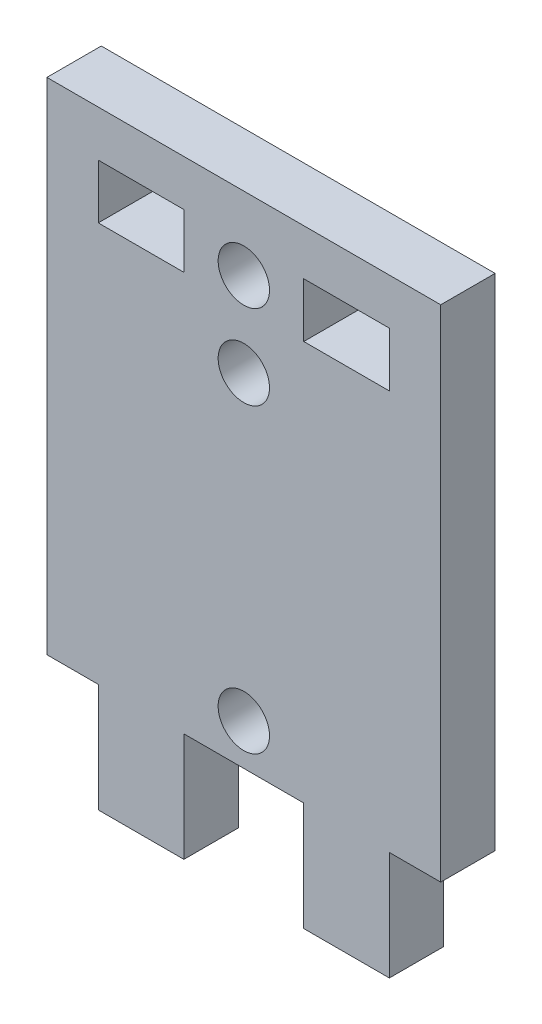
ISO-10303-21;
HEADER;
FILE_DESCRIPTION(('STEP AP214'),'2;1');
FILE_NAME('part.step','',(''),(''),'','','');
FILE_SCHEMA(('AUTOMOTIVE_DESIGN { 1 0 10303 214 1 1 1 1 }'));
ENDSEC;
DATA;
#1=APPLICATION_CONTEXT('core data for automotive mechanical design processes');
#2=APPLICATION_PROTOCOL_DEFINITION('international standard','automotive_design',2000,#1);
#3=PRODUCT_CONTEXT('',#1,'mechanical');
#4=PRODUCT('Part','Part','',(#3));
#5=PRODUCT_RELATED_PRODUCT_CATEGORY('part','',(#4));
#6=PRODUCT_DEFINITION_FORMATION('','',#4);
#7=PRODUCT_DEFINITION_CONTEXT('part definition',#1,'design');
#8=PRODUCT_DEFINITION('design','',#6,#7);
#9=PRODUCT_DEFINITION_SHAPE('','',#8);
#10=(LENGTH_UNIT() NAMED_UNIT(*) SI_UNIT(.MILLI.,.METRE.));
#11=(NAMED_UNIT(*) PLANE_ANGLE_UNIT() SI_UNIT($,.RADIAN.));
#12=(NAMED_UNIT(*) SI_UNIT($,.STERADIAN.) SOLID_ANGLE_UNIT());
#13=UNCERTAINTY_MEASURE_WITH_UNIT(LENGTH_MEASURE(1.E-05),#10,'distance_accuracy_value','');
#14=(GEOMETRIC_REPRESENTATION_CONTEXT(3) GLOBAL_UNCERTAINTY_ASSIGNED_CONTEXT((#13)) GLOBAL_UNIT_ASSIGNED_CONTEXT((#10,
#11,#12)) REPRESENTATION_CONTEXT('',''));
#15=CARTESIAN_POINT('',(0.,0.,0.));
#16=DIRECTION('',(0.,0.,1.));
#17=DIRECTION('',(1.,0.,0.));
#18=AXIS2_PLACEMENT_3D('',#15,#16,#17);
#19=CARTESIAN_POINT('',(-11.5,0.,3.175));
#20=DIRECTION('',(1.,0.,0.));
#21=DIRECTION('',(0.,1.,0.));
#22=AXIS2_PLACEMENT_3D('',#19,#20,#21);
#23=PLANE('',#22);
#24=DIRECTION('',(0.,-1.,0.));
#25=VECTOR('',#24,1.);
#26=CARTESIAN_POINT('',(-11.5,0.,0.));
#27=LINE('',#26,#25);
#28=CARTESIAN_POINT('',(-11.5,18.,0.));
#29=VERTEX_POINT('',#28);
#30=CARTESIAN_POINT('',(-11.5,-11.2,0.));
#31=VERTEX_POINT('',#30);
#32=EDGE_CURVE('E251',#29,#31,#27,.T.);
#33=ORIENTED_EDGE('',*,*,#32,.T.);
#34=DIRECTION('',(0.,0.,-1.));
#35=VECTOR('',#34,1.);
#36=CARTESIAN_POINT('',(-11.5,-11.2,3.175));
#37=LINE('',#36,#35);
#38=CARTESIAN_POINT('',(-11.5,-11.2,3.175));
#39=VERTEX_POINT('',#38);
#40=EDGE_CURVE('E11',#39,#31,#37,.T.);
#41=ORIENTED_EDGE('',*,*,#40,.F.);
#42=DIRECTION('',(0.,-1.,0.));
#43=VECTOR('',#42,1.);
#44=CARTESIAN_POINT('',(-11.5,0.,3.175));
#45=LINE('',#44,#43);
#46=CARTESIAN_POINT('',(-11.5,18.,3.175));
#47=VERTEX_POINT('',#46);
#48=EDGE_CURVE('E260',#47,#39,#45,.T.);
#49=ORIENTED_EDGE('',*,*,#48,.F.);
#50=DIRECTION('',(0.,0.,-1.));
#51=VECTOR('',#50,1.);
#52=CARTESIAN_POINT('',(-11.5,18.,3.175));
#53=LINE('',#52,#51);
#54=EDGE_CURVE('E285',#47,#29,#53,.T.);
#55=ORIENTED_EDGE('',*,*,#54,.T.);
#56=EDGE_LOOP('',(#33,#41,#49,#55));
#57=FACE_BOUND('',#56,.T.);
#58=ADVANCED_FACE('F36',(#57),#23,.F.);
#59=CARTESIAN_POINT('',(-11.5,-11.2,3.175));
#60=DIRECTION('',(0.,1.,0.));
#61=DIRECTION('',(-1.,0.,0.));
#62=AXIS2_PLACEMENT_3D('',#59,#60,#61);
#63=PLANE('',#62);
#64=DIRECTION('',(1.,0.,0.));
#65=VECTOR('',#64,1.);
#66=CARTESIAN_POINT('',(-11.5,-11.2,0.));
#67=LINE('',#66,#65);
#68=CARTESIAN_POINT('',(-8.50000000000002,-11.2,0.));
#69=VERTEX_POINT('',#68);
#70=EDGE_CURVE('E287',#31,#69,#67,.T.);
#71=ORIENTED_EDGE('',*,*,#70,.T.);
#72=DIRECTION('',(0.,0.,-1.));
#73=VECTOR('',#72,1.);
#74=CARTESIAN_POINT('',(-8.50000000000002,-11.2,3.175));
#75=LINE('',#74,#73);
#76=CARTESIAN_POINT('',(-8.50000000000002,-11.2,3.175));
#77=VERTEX_POINT('',#76);
#78=EDGE_CURVE('E43',#77,#69,#75,.T.);
#79=ORIENTED_EDGE('',*,*,#78,.F.);
#80=DIRECTION('',(1.,0.,0.));
#81=VECTOR('',#80,1.);
#82=CARTESIAN_POINT('',(-11.5,-11.2,3.175));
#83=LINE('',#82,#81);
#84=EDGE_CURVE('E262',#39,#77,#83,.T.);
#85=ORIENTED_EDGE('',*,*,#84,.F.);
#86=ORIENTED_EDGE('',*,*,#40,.T.);
#87=EDGE_LOOP('',(#71,#79,#85,#86));
#88=FACE_BOUND('',#87,.T.);
#89=ADVANCED_FACE('F366',(#88),#63,.F.);
#90=CARTESIAN_POINT('',(-8.50000000000002,-11.2,3.175));
#91=DIRECTION('',(1.,0.,0.));
#92=DIRECTION('',(0.,1.,0.));
#93=AXIS2_PLACEMENT_3D('',#90,#91,#92);
#94=PLANE('',#93);
#95=DIRECTION('',(0.,-1.,0.));
#96=VECTOR('',#95,1.);
#97=CARTESIAN_POINT('',(-8.50000000000002,-11.2,0.));
#98=LINE('',#97,#96);
#99=CARTESIAN_POINT('',(-8.50000000000002,-17.55,0.));
#100=VERTEX_POINT('',#99);
#101=EDGE_CURVE('E289',#69,#100,#98,.T.);
#102=ORIENTED_EDGE('',*,*,#101,.T.);
#103=DIRECTION('',(0.,0.,-1.));
#104=VECTOR('',#103,1.);
#105=CARTESIAN_POINT('',(-8.50000000000002,-17.55,3.175));
#106=LINE('',#105,#104);
#107=CARTESIAN_POINT('',(-8.50000000000002,-17.55,3.175));
#108=VERTEX_POINT('',#107);
#109=EDGE_CURVE('E336',#108,#100,#106,.T.);
#110=ORIENTED_EDGE('',*,*,#109,.F.);
#111=DIRECTION('',(0.,-1.,0.));
#112=VECTOR('',#111,1.);
#113=CARTESIAN_POINT('',(-8.50000000000002,-11.2,3.175));
#114=LINE('',#113,#112);
#115=EDGE_CURVE('E265',#77,#108,#114,.T.);
#116=ORIENTED_EDGE('',*,*,#115,.F.);
#117=ORIENTED_EDGE('',*,*,#78,.T.);
#118=EDGE_LOOP('',(#102,#110,#116,#117));
#119=FACE_BOUND('',#118,.T.);
#120=ADVANCED_FACE('F343',(#119),#94,.F.);
#121=CARTESIAN_POINT('',(-8.50000000000002,-17.55,3.175));
#122=DIRECTION('',(0.,1.,0.));
#123=DIRECTION('',(0.,0.,1.));
#124=AXIS2_PLACEMENT_3D('',#121,#122,#123);
#125=PLANE('',#124);
#126=DIRECTION('',(1.,0.,0.));
#127=VECTOR('',#126,1.);
#128=CARTESIAN_POINT('',(-8.50000000000002,-17.55,0.));
#129=LINE('',#128,#127);
#130=CARTESIAN_POINT('',(-3.50000000000002,-17.55,0.));
#131=VERTEX_POINT('',#130);
#132=EDGE_CURVE('E291',#100,#131,#129,.T.);
#133=ORIENTED_EDGE('',*,*,#132,.T.);
#134=DIRECTION('',(0.,0.,-1.));
#135=VECTOR('',#134,1.);
#136=CARTESIAN_POINT('',(-3.50000000000002,-17.55,3.175));
#137=LINE('',#136,#135);
#138=CARTESIAN_POINT('',(-3.50000000000002,-17.55,3.175));
#139=VERTEX_POINT('',#138);
#140=EDGE_CURVE('E333',#139,#131,#137,.T.);
#141=ORIENTED_EDGE('',*,*,#140,.F.);
#142=DIRECTION('',(1.,0.,0.));
#143=VECTOR('',#142,1.);
#144=CARTESIAN_POINT('',(-8.50000000000002,-17.55,3.175));
#145=LINE('',#144,#143);
#146=EDGE_CURVE('E267',#108,#139,#145,.T.);
#147=ORIENTED_EDGE('',*,*,#146,.F.);
#148=ORIENTED_EDGE('',*,*,#109,.T.);
#149=EDGE_LOOP('',(#133,#141,#147,#148));
#150=FACE_BOUND('',#149,.T.);
#151=ADVANCED_FACE('F354',(#150),#125,.F.);
#152=CARTESIAN_POINT('',(-3.50000000000002,-17.55,3.175));
#153=DIRECTION('',(-1.,0.,0.));
#154=DIRECTION('',(0.,-1.,0.));
#155=AXIS2_PLACEMENT_3D('',#152,#153,#154);
#156=PLANE('',#155);
#157=DIRECTION('',(0.,1.,0.));
#158=VECTOR('',#157,1.);
#159=CARTESIAN_POINT('',(-3.50000000000002,-17.55,0.));
#160=LINE('',#159,#158);
#161=CARTESIAN_POINT('',(-3.49999999999993,-11.2,0.));
#162=VERTEX_POINT('',#161);
#163=EDGE_CURVE('E293',#131,#162,#160,.T.);
#164=ORIENTED_EDGE('',*,*,#163,.T.);
#165=DIRECTION('',(0.,0.,-1.));
#166=VECTOR('',#165,1.);
#167=CARTESIAN_POINT('',(-3.49999999999993,-11.2,3.175));
#168=LINE('',#167,#166);
#169=CARTESIAN_POINT('',(-3.49999999999993,-11.2,3.175));
#170=VERTEX_POINT('',#169);
#171=EDGE_CURVE('E330',#170,#162,#168,.T.);
#172=ORIENTED_EDGE('',*,*,#171,.F.);
#173=DIRECTION('',(0.,1.,0.));
#174=VECTOR('',#173,1.);
#175=CARTESIAN_POINT('',(-3.50000000000002,-17.55,3.175));
#176=LINE('',#175,#174);
#177=EDGE_CURVE('E269',#139,#170,#176,.T.);
#178=ORIENTED_EDGE('',*,*,#177,.F.);
#179=ORIENTED_EDGE('',*,*,#140,.T.);
#180=EDGE_LOOP('',(#164,#172,#178,#179));
#181=FACE_BOUND('',#180,.T.);
#182=ADVANCED_FACE('F358',(#181),#156,.F.);
#183=CARTESIAN_POINT('',(-3.49999999999993,-11.2,3.175));
#184=DIRECTION('',(0.,1.,0.));
#185=DIRECTION('',(0.,0.,1.));
#186=AXIS2_PLACEMENT_3D('',#183,#184,#185);
#187=PLANE('',#186);
#188=DIRECTION('',(1.,0.,0.));
#189=VECTOR('',#188,1.);
#190=CARTESIAN_POINT('',(-3.49999999999993,-11.2,0.));
#191=LINE('',#190,#189);
#192=CARTESIAN_POINT('',(3.49999999999994,-11.2,0.));
#193=VERTEX_POINT('',#192);
#194=EDGE_CURVE('E295',#162,#193,#191,.T.);
#195=ORIENTED_EDGE('',*,*,#194,.T.);
#196=DIRECTION('',(0.,0.,-1.));
#197=VECTOR('',#196,1.);
#198=CARTESIAN_POINT('',(3.49999999999994,-11.2,3.175));
#199=LINE('',#198,#197);
#200=CARTESIAN_POINT('',(3.49999999999994,-11.2,3.175));
#201=VERTEX_POINT('',#200);
#202=EDGE_CURVE('E327',#201,#193,#199,.T.);
#203=ORIENTED_EDGE('',*,*,#202,.F.);
#204=DIRECTION('',(1.,0.,0.));
#205=VECTOR('',#204,1.);
#206=CARTESIAN_POINT('',(-3.49999999999993,-11.2,3.175));
#207=LINE('',#206,#205);
#208=EDGE_CURVE('E271',#170,#201,#207,.T.);
#209=ORIENTED_EDGE('',*,*,#208,.F.);
#210=ORIENTED_EDGE('',*,*,#171,.T.);
#211=EDGE_LOOP('',(#195,#203,#209,#210));
#212=FACE_BOUND('',#211,.T.);
#213=ADVANCED_FACE('F398',(#212),#187,.F.);
#214=CARTESIAN_POINT('',(3.49999999999998,-17.55,3.175));
#215=DIRECTION('',(1.,0.,0.));
#216=DIRECTION('',(0.,1.,0.));
#217=AXIS2_PLACEMENT_3D('',#214,#215,#216);
#218=PLANE('',#217);
#219=DIRECTION('',(0.,-1.,0.));
#220=VECTOR('',#219,1.);
#221=CARTESIAN_POINT('',(3.49999999999998,-17.55,0.));
#222=LINE('',#221,#220);
#223=CARTESIAN_POINT('',(3.49999999999998,-17.55,0.));
#224=VERTEX_POINT('',#223);
#225=EDGE_CURVE('E297',#193,#224,#222,.T.);
#226=ORIENTED_EDGE('',*,*,#225,.T.);
#227=DIRECTION('',(0.,0.,-1.));
#228=VECTOR('',#227,1.);
#229=CARTESIAN_POINT('',(3.49999999999998,-17.55,3.175));
#230=LINE('',#229,#228);
#231=CARTESIAN_POINT('',(3.49999999999998,-17.55,3.175));
#232=VERTEX_POINT('',#231);
#233=EDGE_CURVE('E324',#232,#224,#230,.T.);
#234=ORIENTED_EDGE('',*,*,#233,.F.);
#235=DIRECTION('',(0.,-1.,0.));
#236=VECTOR('',#235,1.);
#237=CARTESIAN_POINT('',(3.49999999999998,-17.55,3.175));
#238=LINE('',#237,#236);
#239=EDGE_CURVE('E273',#201,#232,#238,.T.);
#240=ORIENTED_EDGE('',*,*,#239,.F.);
#241=ORIENTED_EDGE('',*,*,#202,.T.);
#242=EDGE_LOOP('',(#226,#234,#240,#241));
#243=FACE_BOUND('',#242,.T.);
#244=ADVANCED_FACE('F396',(#243),#218,.F.);
#245=CARTESIAN_POINT('',(8.49999999999999,-17.55,3.175));
#246=DIRECTION('',(0.,1.,0.));
#247=DIRECTION('',(0.,0.,1.));
#248=AXIS2_PLACEMENT_3D('',#245,#246,#247);
#249=PLANE('',#248);
#250=DIRECTION('',(1.,0.,0.));
#251=VECTOR('',#250,1.);
#252=CARTESIAN_POINT('',(8.49999999999999,-17.55,0.));
#253=LINE('',#252,#251);
#254=CARTESIAN_POINT('',(8.49999999999999,-17.55,0.));
#255=VERTEX_POINT('',#254);
#256=EDGE_CURVE('E299',#224,#255,#253,.T.);
#257=ORIENTED_EDGE('',*,*,#256,.T.);
#258=DIRECTION('',(0.,0.,-1.));
#259=VECTOR('',#258,1.);
#260=CARTESIAN_POINT('',(8.49999999999999,-17.55,3.175));
#261=LINE('',#260,#259);
#262=CARTESIAN_POINT('',(8.49999999999999,-17.55,3.175));
#263=VERTEX_POINT('',#262);
#264=EDGE_CURVE('E321',#263,#255,#261,.T.);
#265=ORIENTED_EDGE('',*,*,#264,.F.);
#266=DIRECTION('',(1.,0.,0.));
#267=VECTOR('',#266,1.);
#268=CARTESIAN_POINT('',(8.49999999999999,-17.55,3.175));
#269=LINE('',#268,#267);
#270=EDGE_CURVE('E275',#232,#263,#269,.T.);
#271=ORIENTED_EDGE('',*,*,#270,.F.);
#272=ORIENTED_EDGE('',*,*,#233,.T.);
#273=EDGE_LOOP('',(#257,#265,#271,#272));
#274=FACE_BOUND('',#273,.T.);
#275=ADVANCED_FACE('F391',(#274),#249,.F.);
#276=CARTESIAN_POINT('',(8.50000000000003,-11.2,3.175));
#277=DIRECTION('',(-1.,0.,0.));
#278=DIRECTION('',(0.,-1.,0.));
#279=AXIS2_PLACEMENT_3D('',#276,#277,#278);
#280=PLANE('',#279);
#281=DIRECTION('',(0.,1.,0.));
#282=VECTOR('',#281,1.);
#283=CARTESIAN_POINT('',(8.50000000000003,-11.2,0.));
#284=LINE('',#283,#282);
#285=CARTESIAN_POINT('',(8.50000000000003,-11.2,0.));
#286=VERTEX_POINT('',#285);
#287=EDGE_CURVE('E301',#255,#286,#284,.T.);
#288=ORIENTED_EDGE('',*,*,#287,.T.);
#289=DIRECTION('',(0.,0.,-1.));
#290=VECTOR('',#289,1.);
#291=CARTESIAN_POINT('',(8.50000000000003,-11.2,3.175));
#292=LINE('',#291,#290);
#293=CARTESIAN_POINT('',(8.50000000000003,-11.2,3.175));
#294=VERTEX_POINT('',#293);
#295=EDGE_CURVE('E318',#294,#286,#292,.T.);
#296=ORIENTED_EDGE('',*,*,#295,.F.);
#297=DIRECTION('',(0.,1.,0.));
#298=VECTOR('',#297,1.);
#299=CARTESIAN_POINT('',(8.50000000000003,-11.2,3.175));
#300=LINE('',#299,#298);
#301=EDGE_CURVE('E277',#263,#294,#300,.T.);
#302=ORIENTED_EDGE('',*,*,#301,.F.);
#303=ORIENTED_EDGE('',*,*,#264,.T.);
#304=EDGE_LOOP('',(#288,#296,#302,#303));
#305=FACE_BOUND('',#304,.T.);
#306=ADVANCED_FACE('F386',(#305),#280,.F.);
#307=CARTESIAN_POINT('',(11.5,-11.2,3.175));
#308=DIRECTION('',(0.,1.,0.));
#309=DIRECTION('',(-1.,0.,0.));
#310=AXIS2_PLACEMENT_3D('',#307,#308,#309);
#311=PLANE('',#310);
#312=DIRECTION('',(1.,0.,0.));
#313=VECTOR('',#312,1.);
#314=CARTESIAN_POINT('',(11.5,-11.2,0.));
#315=LINE('',#314,#313);
#316=CARTESIAN_POINT('',(11.5,-11.2,0.));
#317=VERTEX_POINT('',#316);
#318=EDGE_CURVE('E303',#286,#317,#315,.T.);
#319=ORIENTED_EDGE('',*,*,#318,.T.);
#320=DIRECTION('',(0.,0.,-1.));
#321=VECTOR('',#320,1.);
#322=CARTESIAN_POINT('',(11.5,-11.2,3.175));
#323=LINE('',#322,#321);
#324=CARTESIAN_POINT('',(11.5,-11.2,3.175));
#325=VERTEX_POINT('',#324);
#326=EDGE_CURVE('E315',#325,#317,#323,.T.);
#327=ORIENTED_EDGE('',*,*,#326,.F.);
#328=DIRECTION('',(1.,0.,0.));
#329=VECTOR('',#328,1.);
#330=CARTESIAN_POINT('',(11.5,-11.2,3.175));
#331=LINE('',#330,#329);
#332=EDGE_CURVE('E279',#294,#325,#331,.T.);
#333=ORIENTED_EDGE('',*,*,#332,.F.);
#334=ORIENTED_EDGE('',*,*,#295,.T.);
#335=EDGE_LOOP('',(#319,#327,#333,#334));
#336=FACE_BOUND('',#335,.T.);
#337=ADVANCED_FACE('F381',(#336),#311,.F.);
#338=CARTESIAN_POINT('',(11.5,18.,3.175));
#339=DIRECTION('',(-1.,0.,0.));
#340=DIRECTION('',(0.,-1.,0.));
#341=AXIS2_PLACEMENT_3D('',#338,#339,#340);
#342=PLANE('',#341);
#343=DIRECTION('',(0.,1.,0.));
#344=VECTOR('',#343,1.);
#345=CARTESIAN_POINT('',(11.5,18.,0.));
#346=LINE('',#345,#344);
#347=CARTESIAN_POINT('',(11.5,18.,0.));
#348=VERTEX_POINT('',#347);
#349=EDGE_CURVE('E306',#317,#348,#346,.T.);
#350=ORIENTED_EDGE('',*,*,#349,.T.);
#351=DIRECTION('',(0.,0.,-1.));
#352=VECTOR('',#351,1.);
#353=CARTESIAN_POINT('',(11.5,18.,3.175));
#354=LINE('',#353,#352);
#355=CARTESIAN_POINT('',(11.5,18.,3.175));
#356=VERTEX_POINT('',#355);
#357=EDGE_CURVE('E312',#356,#348,#354,.T.);
#358=ORIENTED_EDGE('',*,*,#357,.F.);
#359=DIRECTION('',(0.,1.,0.));
#360=VECTOR('',#359,1.);
#361=CARTESIAN_POINT('',(11.5,0.,3.175));
#362=LINE('',#361,#360);
#363=EDGE_CURVE('E281',#325,#356,#362,.T.);
#364=ORIENTED_EDGE('',*,*,#363,.F.);
#365=ORIENTED_EDGE('',*,*,#326,.T.);
#366=EDGE_LOOP('',(#350,#358,#364,#365));
#367=FACE_BOUND('',#366,.T.);
#368=ADVANCED_FACE('F376',(#367),#342,.F.);
#369=CARTESIAN_POINT('',(-11.5,18.,3.175));
#370=DIRECTION('',(0.,-1.,0.));
#371=DIRECTION('',(0.,0.,-1.));
#372=AXIS2_PLACEMENT_3D('',#369,#370,#371);
#373=PLANE('',#372);
#374=DIRECTION('',(-1.,0.,0.));
#375=VECTOR('',#374,1.);
#376=CARTESIAN_POINT('',(-11.5,18.,0.));
#377=LINE('',#376,#375);
#378=EDGE_CURVE('E263',#348,#29,#377,.T.);
#379=ORIENTED_EDGE('',*,*,#378,.T.);
#380=ORIENTED_EDGE('',*,*,#54,.F.);
#381=DIRECTION('',(-1.,0.,0.));
#382=VECTOR('',#381,1.);
#383=CARTESIAN_POINT('',(-11.5,18.,3.175));
#384=LINE('',#383,#382);
#385=EDGE_CURVE('E283',#356,#47,#384,.T.);
#386=ORIENTED_EDGE('',*,*,#385,.F.);
#387=ORIENTED_EDGE('',*,*,#357,.T.);
#388=EDGE_LOOP('',(#379,#380,#386,#387));
#389=FACE_BOUND('',#388,.T.);
#390=ADVANCED_FACE('F371',(#389),#373,.F.);
#391=CARTESIAN_POINT('',(0.,0.,3.175));
#392=DIRECTION('',(0.,0.,-1.));
#393=DIRECTION('',(-1.,0.,0.));
#394=AXIS2_PLACEMENT_3D('',#391,#392,#393);
#395=PLANE('',#394);
#396=DIRECTION('',(-1.,0.,0.));
#397=VECTOR('',#396,1.);
#398=CARTESIAN_POINT('',(-3.5,15.3165825697914,3.175));
#399=LINE('',#398,#397);
#400=CARTESIAN_POINT('',(-3.5,15.3165825697914,3.175));
#401=VERTEX_POINT('',#400);
#402=CARTESIAN_POINT('',(-8.5,15.3165825697914,3.175));
#403=VERTEX_POINT('',#402);
#404=EDGE_CURVE('E228',#401,#403,#399,.T.);
#405=ORIENTED_EDGE('',*,*,#404,.F.);
#406=DIRECTION('',(0.,1.,0.));
#407=VECTOR('',#406,1.);
#408=CARTESIAN_POINT('',(-3.5,12.1415825697914,3.175));
#409=LINE('',#408,#407);
#410=CARTESIAN_POINT('',(-3.5,12.1415825697914,3.175));
#411=VERTEX_POINT('',#410);
#412=EDGE_CURVE('E50',#411,#401,#409,.T.);
#413=ORIENTED_EDGE('',*,*,#412,.F.);
#414=DIRECTION('',(1.,0.,0.));
#415=VECTOR('',#414,1.);
#416=CARTESIAN_POINT('',(-3.5,12.1415825697914,3.175));
#417=LINE('',#416,#415);
#418=CARTESIAN_POINT('',(-8.5,12.1415825697914,3.175));
#419=VERTEX_POINT('',#418);
#420=EDGE_CURVE('E217',#419,#411,#417,.T.);
#421=ORIENTED_EDGE('',*,*,#420,.F.);
#422=DIRECTION('',(0.,-1.,0.));
#423=VECTOR('',#422,1.);
#424=CARTESIAN_POINT('',(-8.5,12.1415825697914,3.175));
#425=LINE('',#424,#423);
#426=EDGE_CURVE('E231',#403,#419,#425,.T.);
#427=ORIENTED_EDGE('',*,*,#426,.F.);
#428=EDGE_LOOP('',(#405,#413,#421,#427));
#429=FACE_BOUND('',#428,.T.);
#430=DIRECTION('',(-1.,0.,0.));
#431=VECTOR('',#430,1.);
#432=CARTESIAN_POINT('',(3.5,15.3165825697914,3.175));
#433=LINE('',#432,#431);
#434=CARTESIAN_POINT('',(8.5,15.3165825697914,3.175));
#435=VERTEX_POINT('',#434);
#436=CARTESIAN_POINT('',(3.5,15.3165825697914,3.175));
#437=VERTEX_POINT('',#436);
#438=EDGE_CURVE('E202',#435,#437,#433,.T.);
#439=ORIENTED_EDGE('',*,*,#438,.F.);
#440=DIRECTION('',(0.,1.,0.));
#441=VECTOR('',#440,1.);
#442=CARTESIAN_POINT('',(8.5,12.1415825697914,3.175));
#443=LINE('',#442,#441);
#444=CARTESIAN_POINT('',(8.5,12.1415825697914,3.175));
#445=VERTEX_POINT('',#444);
#446=EDGE_CURVE('E58',#445,#435,#443,.T.);
#447=ORIENTED_EDGE('',*,*,#446,.F.);
#448=DIRECTION('',(1.,0.,0.));
#449=VECTOR('',#448,1.);
#450=CARTESIAN_POINT('',(3.5,12.1415825697914,3.175));
#451=LINE('',#450,#449);
#452=CARTESIAN_POINT('',(3.5,12.1415825697914,3.175));
#453=VERTEX_POINT('',#452);
#454=EDGE_CURVE('E193',#453,#445,#451,.T.);
#455=ORIENTED_EDGE('',*,*,#454,.F.);
#456=DIRECTION('',(0.,-1.,0.));
#457=VECTOR('',#456,1.);
#458=CARTESIAN_POINT('',(3.5,12.1415825697914,3.175));
#459=LINE('',#458,#457);
#460=EDGE_CURVE('E196',#437,#453,#459,.T.);
#461=ORIENTED_EDGE('',*,*,#460,.F.);
#462=EDGE_LOOP('',(#439,#447,#455,#461));
#463=FACE_BOUND('',#462,.T.);
#464=CARTESIAN_POINT('',(0.,13.7290825697914,3.175));
#465=DIRECTION('',(0.,0.,1.));
#466=DIRECTION('',(1.,0.,0.));
#467=AXIS2_PLACEMENT_3D('',#464,#465,#466);
#468=CIRCLE('',#467,1.5);
#469=CARTESIAN_POINT('',(1.5,13.7290825697914,3.175));
#470=VERTEX_POINT('',#469);
#471=EDGE_CURVE('E209',#470,#470,#468,.T.);
#472=ORIENTED_EDGE('',*,*,#471,.F.);
#473=EDGE_LOOP('',(#472));
#474=FACE_BOUND('',#473,.T.);
#475=CARTESIAN_POINT('',(0.,-8.8,3.175));
#476=DIRECTION('',(0.,0.,1.));
#477=DIRECTION('',(1.,0.,0.));
#478=AXIS2_PLACEMENT_3D('',#475,#476,#477);
#479=CIRCLE('',#478,1.5);
#480=CARTESIAN_POINT('',(1.5,-8.8,3.175));
#481=VERTEX_POINT('',#480);
#482=EDGE_CURVE('E252',#481,#481,#479,.T.);
#483=ORIENTED_EDGE('',*,*,#482,.F.);
#484=EDGE_LOOP('',(#483));
#485=FACE_BOUND('',#484,.T.);
#486=CARTESIAN_POINT('',(0.,8.8,3.175));
#487=DIRECTION('',(0.,0.,1.));
#488=DIRECTION('',(-1.,0.,0.));
#489=AXIS2_PLACEMENT_3D('',#486,#487,#488);
#490=CIRCLE('',#489,1.5);
#491=CARTESIAN_POINT('',(-1.5,8.8,3.175));
#492=VERTEX_POINT('',#491);
#493=EDGE_CURVE('E245',#492,#492,#490,.T.);
#494=ORIENTED_EDGE('',*,*,#493,.F.);
#495=EDGE_LOOP('',(#494));
#496=FACE_BOUND('',#495,.T.);
#497=ORIENTED_EDGE('',*,*,#48,.T.);
#498=ORIENTED_EDGE('',*,*,#84,.T.);
#499=ORIENTED_EDGE('',*,*,#115,.T.);
#500=ORIENTED_EDGE('',*,*,#146,.T.);
#501=ORIENTED_EDGE('',*,*,#177,.T.);
#502=ORIENTED_EDGE('',*,*,#208,.T.);
#503=ORIENTED_EDGE('',*,*,#239,.T.);
#504=ORIENTED_EDGE('',*,*,#270,.T.);
#505=ORIENTED_EDGE('',*,*,#301,.T.);
#506=ORIENTED_EDGE('',*,*,#332,.T.);
#507=ORIENTED_EDGE('',*,*,#363,.T.);
#508=ORIENTED_EDGE('',*,*,#385,.T.);
#509=EDGE_LOOP('',(#497,#498,#499,#500,#501,#502,#503,#504,#505,#506,#507,#508));
#510=FACE_BOUND('',#509,.T.);
#511=ADVANCED_FACE('F362',(#429,#463,#474,#485,#496,#510),#395,.F.);
#512=CARTESIAN_POINT('',(0.,0.,0.));
#513=DIRECTION('',(0.,0.,-1.));
#514=DIRECTION('',(-1.,0.,0.));
#515=AXIS2_PLACEMENT_3D('',#512,#513,#514);
#516=PLANE('',#515);
#517=DIRECTION('',(0.,1.,0.));
#518=VECTOR('',#517,1.);
#519=CARTESIAN_POINT('',(-3.5,12.1415825697914,0.));
#520=LINE('',#519,#518);
#521=CARTESIAN_POINT('',(-3.5,12.1415825697914,0.));
#522=VERTEX_POINT('',#521);
#523=CARTESIAN_POINT('',(-3.5,15.3165825697914,0.));
#524=VERTEX_POINT('',#523);
#525=EDGE_CURVE('E213',#522,#524,#520,.T.);
#526=ORIENTED_EDGE('',*,*,#525,.T.);
#527=DIRECTION('',(-1.,0.,0.));
#528=VECTOR('',#527,1.);
#529=CARTESIAN_POINT('',(-3.5,15.3165825697914,0.));
#530=LINE('',#529,#528);
#531=CARTESIAN_POINT('',(-8.5,15.3165825697914,0.));
#532=VERTEX_POINT('',#531);
#533=EDGE_CURVE('E216',#524,#532,#530,.T.);
#534=ORIENTED_EDGE('',*,*,#533,.T.);
#535=DIRECTION('',(0.,-1.,0.));
#536=VECTOR('',#535,1.);
#537=CARTESIAN_POINT('',(-8.5,12.1415825697914,0.));
#538=LINE('',#537,#536);
#539=CARTESIAN_POINT('',(-8.5,12.1415825697914,0.));
#540=VERTEX_POINT('',#539);
#541=EDGE_CURVE('E220',#532,#540,#538,.T.);
#542=ORIENTED_EDGE('',*,*,#541,.T.);
#543=DIRECTION('',(1.,0.,0.));
#544=VECTOR('',#543,1.);
#545=CARTESIAN_POINT('',(-3.5,12.1415825697914,0.));
#546=LINE('',#545,#544);
#547=EDGE_CURVE('E223',#540,#522,#546,.T.);
#548=ORIENTED_EDGE('',*,*,#547,.T.);
#549=EDGE_LOOP('',(#526,#534,#542,#548));
#550=FACE_BOUND('',#549,.T.);
#551=DIRECTION('',(0.,1.,0.));
#552=VECTOR('',#551,1.);
#553=CARTESIAN_POINT('',(8.5,12.1415825697914,0.));
#554=LINE('',#553,#552);
#555=CARTESIAN_POINT('',(8.5,12.1415825697914,0.));
#556=VERTEX_POINT('',#555);
#557=CARTESIAN_POINT('',(8.5,15.3165825697914,0.));
#558=VERTEX_POINT('',#557);
#559=EDGE_CURVE('E174',#556,#558,#554,.T.);
#560=ORIENTED_EDGE('',*,*,#559,.T.);
#561=DIRECTION('',(-1.,0.,0.));
#562=VECTOR('',#561,1.);
#563=CARTESIAN_POINT('',(3.5,15.3165825697914,0.));
#564=LINE('',#563,#562);
#565=CARTESIAN_POINT('',(3.5,15.3165825697914,0.));
#566=VERTEX_POINT('',#565);
#567=EDGE_CURVE('E184',#558,#566,#564,.T.);
#568=ORIENTED_EDGE('',*,*,#567,.T.);
#569=DIRECTION('',(0.,-1.,0.));
#570=VECTOR('',#569,1.);
#571=CARTESIAN_POINT('',(3.5,12.1415825697914,0.));
#572=LINE('',#571,#570);
#573=CARTESIAN_POINT('',(3.5,12.1415825697914,0.));
#574=VERTEX_POINT('',#573);
#575=EDGE_CURVE('E188',#566,#574,#572,.T.);
#576=ORIENTED_EDGE('',*,*,#575,.T.);
#577=DIRECTION('',(1.,0.,0.));
#578=VECTOR('',#577,1.);
#579=CARTESIAN_POINT('',(3.5,12.1415825697914,0.));
#580=LINE('',#579,#578);
#581=EDGE_CURVE('E180',#574,#556,#580,.T.);
#582=ORIENTED_EDGE('',*,*,#581,.T.);
#583=EDGE_LOOP('',(#560,#568,#576,#582));
#584=FACE_BOUND('',#583,.T.);
#585=CARTESIAN_POINT('',(0.,13.7290825697914,0.));
#586=DIRECTION('',(0.,0.,1.));
#587=DIRECTION('',(1.,0.,0.));
#588=AXIS2_PLACEMENT_3D('',#585,#586,#587);
#589=CIRCLE('',#588,1.5);
#590=CARTESIAN_POINT('',(1.5,13.7290825697914,0.));
#591=VERTEX_POINT('',#590);
#592=EDGE_CURVE('E242',#591,#591,#589,.T.);
#593=ORIENTED_EDGE('',*,*,#592,.T.);
#594=EDGE_LOOP('',(#593));
#595=FACE_BOUND('',#594,.T.);
#596=CARTESIAN_POINT('',(0.,-8.8,0.));
#597=DIRECTION('',(0.,0.,1.));
#598=DIRECTION('',(1.,0.,0.));
#599=AXIS2_PLACEMENT_3D('',#596,#597,#598);
#600=CIRCLE('',#599,1.5);
#601=CARTESIAN_POINT('',(1.5,-8.8,0.));
#602=VERTEX_POINT('',#601);
#603=EDGE_CURVE('E248',#602,#602,#600,.T.);
#604=ORIENTED_EDGE('',*,*,#603,.T.);
#605=EDGE_LOOP('',(#604));
#606=FACE_BOUND('',#605,.T.);
#607=CARTESIAN_POINT('',(0.,8.8,0.));
#608=DIRECTION('',(0.,0.,1.));
#609=DIRECTION('',(-1.,0.,0.));
#610=AXIS2_PLACEMENT_3D('',#607,#608,#609);
#611=CIRCLE('',#610,1.5);
#612=CARTESIAN_POINT('',(-1.5,8.8,0.));
#613=VERTEX_POINT('',#612);
#614=EDGE_CURVE('E255',#613,#613,#611,.T.);
#615=ORIENTED_EDGE('',*,*,#614,.T.);
#616=EDGE_LOOP('',(#615));
#617=FACE_BOUND('',#616,.T.);
#618=ORIENTED_EDGE('',*,*,#32,.F.);
#619=ORIENTED_EDGE('',*,*,#378,.F.);
#620=ORIENTED_EDGE('',*,*,#349,.F.);
#621=ORIENTED_EDGE('',*,*,#318,.F.);
#622=ORIENTED_EDGE('',*,*,#287,.F.);
#623=ORIENTED_EDGE('',*,*,#256,.F.);
#624=ORIENTED_EDGE('',*,*,#225,.F.);
#625=ORIENTED_EDGE('',*,*,#194,.F.);
#626=ORIENTED_EDGE('',*,*,#163,.F.);
#627=ORIENTED_EDGE('',*,*,#132,.F.);
#628=ORIENTED_EDGE('',*,*,#101,.F.);
#629=ORIENTED_EDGE('',*,*,#70,.F.);
#630=EDGE_LOOP('',(#618,#619,#620,#621,#622,#623,#624,#625,#626,#627,#628,#629));
#631=FACE_BOUND('',#630,.T.);
#632=ADVANCED_FACE('F190',(#550,#584,#595,#606,#617,#631),#516,.T.);
#633=CARTESIAN_POINT('',(0.,8.8,0.));
#634=DIRECTION('',(0.,0.,1.));
#635=DIRECTION('',(1.,0.,0.));
#636=AXIS2_PLACEMENT_3D('',#633,#634,#635);
#637=CYLINDRICAL_SURFACE('',#636,1.5);
#638=ORIENTED_EDGE('',*,*,#614,.F.);
#639=EDGE_LOOP('',(#638));
#640=FACE_BOUND('',#639,.T.);
#641=ORIENTED_EDGE('',*,*,#493,.T.);
#642=EDGE_LOOP('',(#641));
#643=FACE_BOUND('',#642,.T.);
#644=ADVANCED_FACE('F483',(#640,#643),#637,.F.);
#645=CARTESIAN_POINT('',(0.,-8.8,0.));
#646=DIRECTION('',(0.,0.,1.));
#647=DIRECTION('',(1.,0.,0.));
#648=AXIS2_PLACEMENT_3D('',#645,#646,#647);
#649=CYLINDRICAL_SURFACE('',#648,1.5);
#650=ORIENTED_EDGE('',*,*,#603,.F.);
#651=EDGE_LOOP('',(#650));
#652=FACE_BOUND('',#651,.T.);
#653=ORIENTED_EDGE('',*,*,#482,.T.);
#654=EDGE_LOOP('',(#653));
#655=FACE_BOUND('',#654,.T.);
#656=ADVANCED_FACE('F488',(#652,#655),#649,.F.);
#657=CARTESIAN_POINT('',(0.,13.7290825697914,0.));
#658=DIRECTION('',(0.,0.,1.));
#659=DIRECTION('',(1.,0.,0.));
#660=AXIS2_PLACEMENT_3D('',#657,#658,#659);
#661=CYLINDRICAL_SURFACE('',#660,1.5);
#662=ORIENTED_EDGE('',*,*,#592,.F.);
#663=EDGE_LOOP('',(#662));
#664=FACE_BOUND('',#663,.T.);
#665=ORIENTED_EDGE('',*,*,#471,.T.);
#666=EDGE_LOOP('',(#665));
#667=FACE_BOUND('',#666,.T.);
#668=ADVANCED_FACE('F500',(#664,#667),#661,.F.);
#669=CARTESIAN_POINT('',(8.5,12.1415825697914,0.));
#670=DIRECTION('',(1.,0.,0.));
#671=DIRECTION('',(0.,0.,-1.));
#672=AXIS2_PLACEMENT_3D('',#669,#670,#671);
#673=PLANE('',#672);
#674=ORIENTED_EDGE('',*,*,#446,.T.);
#675=DIRECTION('',(0.,0.,1.));
#676=VECTOR('',#675,1.);
#677=CARTESIAN_POINT('',(8.5,15.3165825697914,0.));
#678=LINE('',#677,#676);
#679=EDGE_CURVE('E170',#558,#435,#678,.T.);
#680=ORIENTED_EDGE('',*,*,#679,.F.);
#681=ORIENTED_EDGE('',*,*,#559,.F.);
#682=DIRECTION('',(0.,0.,1.));
#683=VECTOR('',#682,1.);
#684=CARTESIAN_POINT('',(8.5,12.1415825697914,0.));
#685=LINE('',#684,#683);
#686=EDGE_CURVE('E207',#556,#445,#685,.T.);
#687=ORIENTED_EDGE('',*,*,#686,.T.);
#688=EDGE_LOOP('',(#674,#680,#681,#687));
#689=FACE_BOUND('',#688,.T.);
#690=ADVANCED_FACE('F172',(#689),#673,.F.);
#691=CARTESIAN_POINT('',(3.5,12.1415825697914,0.));
#692=DIRECTION('',(0.,-1.,0.));
#693=DIRECTION('',(0.,0.,-1.));
#694=AXIS2_PLACEMENT_3D('',#691,#692,#693);
#695=PLANE('',#694);
#696=ORIENTED_EDGE('',*,*,#454,.T.);
#697=ORIENTED_EDGE('',*,*,#686,.F.);
#698=ORIENTED_EDGE('',*,*,#581,.F.);
#699=DIRECTION('',(0.,0.,1.));
#700=VECTOR('',#699,1.);
#701=CARTESIAN_POINT('',(3.5,12.1415825697914,0.));
#702=LINE('',#701,#700);
#703=EDGE_CURVE('E210',#574,#453,#702,.T.);
#704=ORIENTED_EDGE('',*,*,#703,.T.);
#705=EDGE_LOOP('',(#696,#697,#698,#704));
#706=FACE_BOUND('',#705,.T.);
#707=ADVANCED_FACE('F533',(#706),#695,.F.);
#708=CARTESIAN_POINT('',(3.5,12.1415825697914,0.));
#709=DIRECTION('',(-1.,0.,0.));
#710=DIRECTION('',(0.,-1.,0.));
#711=AXIS2_PLACEMENT_3D('',#708,#709,#710);
#712=PLANE('',#711);
#713=ORIENTED_EDGE('',*,*,#460,.T.);
#714=ORIENTED_EDGE('',*,*,#703,.F.);
#715=ORIENTED_EDGE('',*,*,#575,.F.);
#716=DIRECTION('',(0.,0.,1.));
#717=VECTOR('',#716,1.);
#718=CARTESIAN_POINT('',(3.5,15.3165825697914,0.));
#719=LINE('',#718,#717);
#720=EDGE_CURVE('E179',#566,#437,#719,.T.);
#721=ORIENTED_EDGE('',*,*,#720,.T.);
#722=EDGE_LOOP('',(#713,#714,#715,#721));
#723=FACE_BOUND('',#722,.T.);
#724=ADVANCED_FACE('F542',(#723),#712,.F.);
#725=CARTESIAN_POINT('',(3.5,15.3165825697914,0.));
#726=DIRECTION('',(0.,1.,0.));
#727=DIRECTION('',(0.,0.,1.));
#728=AXIS2_PLACEMENT_3D('',#725,#726,#727);
#729=PLANE('',#728);
#730=ORIENTED_EDGE('',*,*,#438,.T.);
#731=ORIENTED_EDGE('',*,*,#720,.F.);
#732=ORIENTED_EDGE('',*,*,#567,.F.);
#733=ORIENTED_EDGE('',*,*,#679,.T.);
#734=EDGE_LOOP('',(#730,#731,#732,#733));
#735=FACE_BOUND('',#734,.T.);
#736=ADVANCED_FACE('F185',(#735),#729,.F.);
#737=CARTESIAN_POINT('',(-3.5,12.1415825697914,0.));
#738=DIRECTION('',(1.,0.,0.));
#739=DIRECTION('',(0.,1.,0.));
#740=AXIS2_PLACEMENT_3D('',#737,#738,#739);
#741=PLANE('',#740);
#742=ORIENTED_EDGE('',*,*,#412,.T.);
#743=DIRECTION('',(0.,0.,1.));
#744=VECTOR('',#743,1.);
#745=CARTESIAN_POINT('',(-3.5,15.3165825697914,0.));
#746=LINE('',#745,#744);
#747=EDGE_CURVE('E226',#524,#401,#746,.T.);
#748=ORIENTED_EDGE('',*,*,#747,.F.);
#749=ORIENTED_EDGE('',*,*,#525,.F.);
#750=DIRECTION('',(0.,0.,1.));
#751=VECTOR('',#750,1.);
#752=CARTESIAN_POINT('',(-3.5,12.1415825697914,0.));
#753=LINE('',#752,#751);
#754=EDGE_CURVE('E203',#522,#411,#753,.T.);
#755=ORIENTED_EDGE('',*,*,#754,.T.);
#756=EDGE_LOOP('',(#742,#748,#749,#755));
#757=FACE_BOUND('',#756,.T.);
#758=ADVANCED_FACE('F561',(#757),#741,.F.);
#759=CARTESIAN_POINT('',(-3.5,12.1415825697914,0.));
#760=DIRECTION('',(0.,-1.,0.));
#761=DIRECTION('',(1.,0.,0.));
#762=AXIS2_PLACEMENT_3D('',#759,#760,#761);
#763=PLANE('',#762);
#764=ORIENTED_EDGE('',*,*,#420,.T.);
#765=ORIENTED_EDGE('',*,*,#754,.F.);
#766=ORIENTED_EDGE('',*,*,#547,.F.);
#767=DIRECTION('',(0.,0.,1.));
#768=VECTOR('',#767,1.);
#769=CARTESIAN_POINT('',(-8.5,12.1415825697914,0.));
#770=LINE('',#769,#768);
#771=EDGE_CURVE('E237',#540,#419,#770,.T.);
#772=ORIENTED_EDGE('',*,*,#771,.T.);
#773=EDGE_LOOP('',(#764,#765,#766,#772));
#774=FACE_BOUND('',#773,.T.);
#775=ADVANCED_FACE('F570',(#774),#763,.F.);
#776=CARTESIAN_POINT('',(-8.5,12.1415825697914,0.));
#777=DIRECTION('',(-1.,0.,0.));
#778=DIRECTION('',(0.,0.,1.));
#779=AXIS2_PLACEMENT_3D('',#776,#777,#778);
#780=PLANE('',#779);
#781=ORIENTED_EDGE('',*,*,#426,.T.);
#782=ORIENTED_EDGE('',*,*,#771,.F.);
#783=ORIENTED_EDGE('',*,*,#541,.F.);
#784=DIRECTION('',(0.,0.,1.));
#785=VECTOR('',#784,1.);
#786=CARTESIAN_POINT('',(-8.5,15.3165825697914,0.));
#787=LINE('',#786,#785);
#788=EDGE_CURVE('E239',#532,#403,#787,.T.);
#789=ORIENTED_EDGE('',*,*,#788,.T.);
#790=EDGE_LOOP('',(#781,#782,#783,#789));
#791=FACE_BOUND('',#790,.T.);
#792=ADVANCED_FACE('F579',(#791),#780,.F.);
#793=CARTESIAN_POINT('',(-3.5,15.3165825697914,0.));
#794=DIRECTION('',(0.,1.,0.));
#795=DIRECTION('',(-1.,0.,0.));
#796=AXIS2_PLACEMENT_3D('',#793,#794,#795);
#797=PLANE('',#796);
#798=ORIENTED_EDGE('',*,*,#404,.T.);
#799=ORIENTED_EDGE('',*,*,#788,.F.);
#800=ORIENTED_EDGE('',*,*,#533,.F.);
#801=ORIENTED_EDGE('',*,*,#747,.T.);
#802=EDGE_LOOP('',(#798,#799,#800,#801));
#803=FACE_BOUND('',#802,.T.);
#804=ADVANCED_FACE('F589',(#803),#797,.F.);
#805=CLOSED_SHELL('',(#58,#89,#120,#151,#182,#213,#244,#275,#306,#337,#368,#390,#511,#632,#644,
#656,#668,#690,#707,#724,#736,#758,#775,#792,#804));
#806=MANIFOLD_SOLID_BREP('B2',#805);
#807=ADVANCED_BREP_SHAPE_REPRESENTATION('',(#18,#806),#14);
#808=SHAPE_DEFINITION_REPRESENTATION(#9,#807);
ENDSEC;
END-ISO-10303-21;
